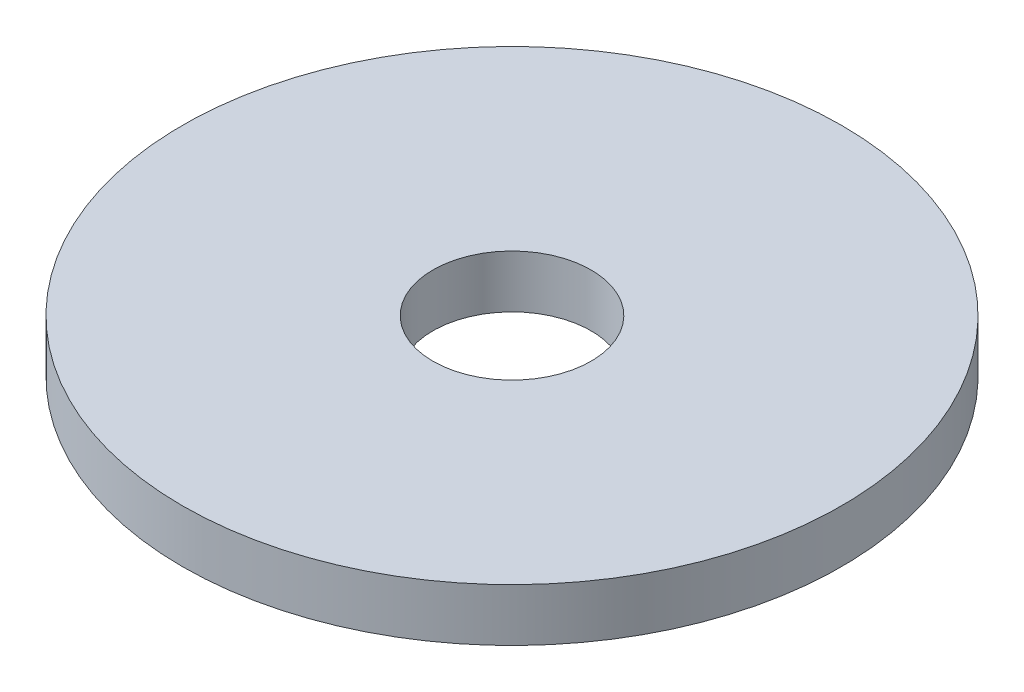
ISO-10303-21;
HEADER;
FILE_DESCRIPTION(('STEP AP214'),'2;1');
FILE_NAME('part.step','',(''),(''),'','','');
FILE_SCHEMA(('AUTOMOTIVE_DESIGN { 1 0 10303 214 1 1 1 1 }'));
ENDSEC;
DATA;
#1=APPLICATION_CONTEXT('core data for automotive mechanical design processes');
#2=APPLICATION_PROTOCOL_DEFINITION('international standard','automotive_design',2000,#1);
#3=PRODUCT_CONTEXT('',#1,'mechanical');
#4=PRODUCT('Part','Part','',(#3));
#5=PRODUCT_RELATED_PRODUCT_CATEGORY('part','',(#4));
#6=PRODUCT_DEFINITION_FORMATION('','',#4);
#7=PRODUCT_DEFINITION_CONTEXT('part definition',#1,'design');
#8=PRODUCT_DEFINITION('design','',#6,#7);
#9=PRODUCT_DEFINITION_SHAPE('','',#8);
#10=(LENGTH_UNIT() NAMED_UNIT(*) SI_UNIT(.MILLI.,.METRE.));
#11=(NAMED_UNIT(*) PLANE_ANGLE_UNIT() SI_UNIT($,.RADIAN.));
#12=(NAMED_UNIT(*) SI_UNIT($,.STERADIAN.) SOLID_ANGLE_UNIT());
#13=UNCERTAINTY_MEASURE_WITH_UNIT(LENGTH_MEASURE(1.E-05),#10,'distance_accuracy_value','');
#14=(GEOMETRIC_REPRESENTATION_CONTEXT(3) GLOBAL_UNCERTAINTY_ASSIGNED_CONTEXT((#13)) GLOBAL_UNIT_ASSIGNED_CONTEXT((#10,
#11,#12)) REPRESENTATION_CONTEXT('',''));
#15=CARTESIAN_POINT('',(0.,0.,0.));
#16=DIRECTION('',(0.,0.,1.));
#17=DIRECTION('',(1.,0.,0.));
#18=AXIS2_PLACEMENT_3D('',#15,#16,#17);
#19=CARTESIAN_POINT('',(0.,1.,0.));
#20=DIRECTION('',(0.,1.,0.));
#21=DIRECTION('',(0.,0.,1.));
#22=AXIS2_PLACEMENT_3D('',#19,#20,#21);
#23=PLANE('',#22);
#24=CARTESIAN_POINT('',(0.,1.,0.));
#25=DIRECTION('',(0.,1.,0.));
#26=DIRECTION('',(0.,0.,1.));
#27=AXIS2_PLACEMENT_3D('',#24,#25,#26);
#28=CIRCLE('',#27,6.25);
#29=CARTESIAN_POINT('',(0.,1.,6.25));
#30=VERTEX_POINT('',#29);
#31=EDGE_CURVE('E10',#30,#30,#28,.T.);
#32=ORIENTED_EDGE('',*,*,#31,.T.);
#33=EDGE_LOOP('',(#32));
#34=FACE_BOUND('',#33,.T.);
#35=CARTESIAN_POINT('',(0.,1.,0.));
#36=DIRECTION('',(0.,1.,0.));
#37=DIRECTION('',(0.,0.,1.));
#38=AXIS2_PLACEMENT_3D('',#35,#36,#37);
#39=CIRCLE('',#38,1.5);
#40=CARTESIAN_POINT('',(0.,1.,1.5));
#41=VERTEX_POINT('',#40);
#42=EDGE_CURVE('E43',#41,#41,#39,.T.);
#43=ORIENTED_EDGE('',*,*,#42,.F.);
#44=EDGE_LOOP('',(#43));
#45=FACE_BOUND('',#44,.T.);
#46=ADVANCED_FACE('F32',(#34,#45),#23,.T.);
#47=CARTESIAN_POINT('',(0.,0.,0.));
#48=DIRECTION('',(0.,1.,0.));
#49=DIRECTION('',(0.,0.,1.));
#50=AXIS2_PLACEMENT_3D('',#47,#48,#49);
#51=PLANE('',#50);
#52=CARTESIAN_POINT('',(0.,0.,0.));
#53=DIRECTION('',(0.,1.,0.));
#54=DIRECTION('',(0.,0.,1.));
#55=AXIS2_PLACEMENT_3D('',#52,#53,#54);
#56=CIRCLE('',#55,6.25);
#57=CARTESIAN_POINT('',(0.,0.,6.25));
#58=VERTEX_POINT('',#57);
#59=EDGE_CURVE('E36',#58,#58,#56,.T.);
#60=ORIENTED_EDGE('',*,*,#59,.F.);
#61=EDGE_LOOP('',(#60));
#62=FACE_BOUND('',#61,.T.);
#63=CARTESIAN_POINT('',(0.,0.,0.));
#64=DIRECTION('',(0.,1.,0.));
#65=DIRECTION('',(0.,0.,1.));
#66=AXIS2_PLACEMENT_3D('',#63,#64,#65);
#67=CIRCLE('',#66,1.5);
#68=CARTESIAN_POINT('',(0.,0.,1.5));
#69=VERTEX_POINT('',#68);
#70=EDGE_CURVE('E45',#69,#69,#67,.T.);
#71=ORIENTED_EDGE('',*,*,#70,.T.);
#72=EDGE_LOOP('',(#71));
#73=FACE_BOUND('',#72,.T.);
#74=ADVANCED_FACE('F55',(#62,#73),#51,.F.);
#75=CARTESIAN_POINT('',(0.,1.,0.));
#76=DIRECTION('',(0.,-1.,0.));
#77=DIRECTION('',(0.,0.,-1.));
#78=AXIS2_PLACEMENT_3D('',#75,#76,#77);
#79=CYLINDRICAL_SURFACE('',#78,6.25);
#80=ORIENTED_EDGE('',*,*,#31,.F.);
#81=EDGE_LOOP('',(#80));
#82=FACE_BOUND('',#81,.T.);
#83=ORIENTED_EDGE('',*,*,#59,.T.);
#84=EDGE_LOOP('',(#83));
#85=FACE_BOUND('',#84,.T.);
#86=ADVANCED_FACE('F34',(#82,#85),#79,.T.);
#87=CARTESIAN_POINT('',(0.,1.,0.));
#88=DIRECTION('',(0.,-1.,0.));
#89=DIRECTION('',(0.,0.,-1.));
#90=AXIS2_PLACEMENT_3D('',#87,#88,#89);
#91=CYLINDRICAL_SURFACE('',#90,1.5);
#92=ORIENTED_EDGE('',*,*,#42,.T.);
#93=EDGE_LOOP('',(#92));
#94=FACE_BOUND('',#93,.T.);
#95=ORIENTED_EDGE('',*,*,#70,.F.);
#96=EDGE_LOOP('',(#95));
#97=FACE_BOUND('',#96,.T.);
#98=ADVANCED_FACE('F51',(#94,#97),#91,.F.);
#99=CLOSED_SHELL('',(#46,#74,#86,#98));
#100=MANIFOLD_SOLID_BREP('B2',#99);
#101=ADVANCED_BREP_SHAPE_REPRESENTATION('',(#18,#100),#14);
#102=SHAPE_DEFINITION_REPRESENTATION(#9,#101);
ENDSEC;
END-ISO-10303-21;
